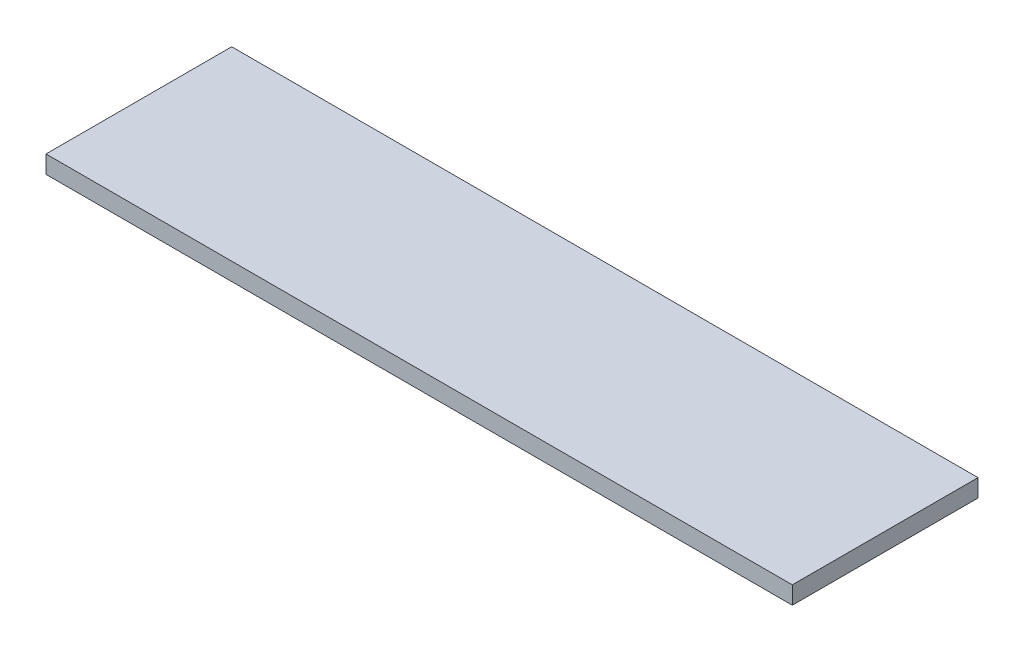
ISO-10303-21;
HEADER;
FILE_DESCRIPTION(('STEP AP214'),'2;1');
FILE_NAME('part.step','',(''),(''),'','','');
FILE_SCHEMA(('AUTOMOTIVE_DESIGN { 1 0 10303 214 1 1 1 1 }'));
ENDSEC;
DATA;
#1=APPLICATION_CONTEXT('core data for automotive mechanical design processes');
#2=APPLICATION_PROTOCOL_DEFINITION('international standard','automotive_design',2000,#1);
#3=PRODUCT_CONTEXT('',#1,'mechanical');
#4=PRODUCT('Part','Part','',(#3));
#5=PRODUCT_RELATED_PRODUCT_CATEGORY('part','',(#4));
#6=PRODUCT_DEFINITION_FORMATION('','',#4);
#7=PRODUCT_DEFINITION_CONTEXT('part definition',#1,'design');
#8=PRODUCT_DEFINITION('design','',#6,#7);
#9=PRODUCT_DEFINITION_SHAPE('','',#8);
#10=(LENGTH_UNIT() NAMED_UNIT(*) SI_UNIT(.MILLI.,.METRE.));
#11=(NAMED_UNIT(*) PLANE_ANGLE_UNIT() SI_UNIT($,.RADIAN.));
#12=(NAMED_UNIT(*) SI_UNIT($,.STERADIAN.) SOLID_ANGLE_UNIT());
#13=UNCERTAINTY_MEASURE_WITH_UNIT(LENGTH_MEASURE(1.E-05),#10,'distance_accuracy_value','');
#14=(GEOMETRIC_REPRESENTATION_CONTEXT(3) GLOBAL_UNCERTAINTY_ASSIGNED_CONTEXT((#13)) GLOBAL_UNIT_ASSIGNED_CONTEXT((#10,
#11,#12)) REPRESENTATION_CONTEXT('',''));
#15=CARTESIAN_POINT('',(0.,0.,0.));
#16=DIRECTION('',(0.,0.,1.));
#17=DIRECTION('',(1.,0.,0.));
#18=AXIS2_PLACEMENT_3D('',#15,#16,#17);
#19=CARTESIAN_POINT('',(21.1,1.,-5.25));
#20=DIRECTION('',(-1.,0.,0.));
#21=DIRECTION('',(0.,0.,1.));
#22=AXIS2_PLACEMENT_3D('',#19,#20,#21);
#23=PLANE('',#22);
#24=DIRECTION('',(0.,0.,-1.));
#25=VECTOR('',#24,1.);
#26=CARTESIAN_POINT('',(21.1,0.,-5.25));
#27=LINE('',#26,#25);
#28=CARTESIAN_POINT('',(21.1,0.,5.25));
#29=VERTEX_POINT('',#28);
#30=CARTESIAN_POINT('',(21.1,0.,-5.25));
#31=VERTEX_POINT('',#30);
#32=EDGE_CURVE('E102',#29,#31,#27,.T.);
#33=ORIENTED_EDGE('',*,*,#32,.T.);
#34=DIRECTION('',(0.,-1.,0.));
#35=VECTOR('',#34,1.);
#36=CARTESIAN_POINT('',(21.1,1.,-5.25));
#37=LINE('',#36,#35);
#38=CARTESIAN_POINT('',(21.1,1.,-5.25));
#39=VERTEX_POINT('',#38);
#40=EDGE_CURVE('E11',#39,#31,#37,.T.);
#41=ORIENTED_EDGE('',*,*,#40,.F.);
#42=DIRECTION('',(0.,0.,-1.));
#43=VECTOR('',#42,1.);
#44=CARTESIAN_POINT('',(21.1,1.,-5.25));
#45=LINE('',#44,#43);
#46=CARTESIAN_POINT('',(21.1,1.,5.25));
#47=VERTEX_POINT('',#46);
#48=EDGE_CURVE('E90',#47,#39,#45,.T.);
#49=ORIENTED_EDGE('',*,*,#48,.F.);
#50=DIRECTION('',(0.,-1.,0.));
#51=VECTOR('',#50,1.);
#52=CARTESIAN_POINT('',(21.1,1.,5.25));
#53=LINE('',#52,#51);
#54=EDGE_CURVE('E98',#47,#29,#53,.T.);
#55=ORIENTED_EDGE('',*,*,#54,.T.);
#56=EDGE_LOOP('',(#33,#41,#49,#55));
#57=FACE_BOUND('',#56,.T.);
#58=ADVANCED_FACE('F39',(#57),#23,.F.);
#59=CARTESIAN_POINT('',(-21.1,1.,-5.25));
#60=DIRECTION('',(0.,0.,1.));
#61=DIRECTION('',(1.,0.,0.));
#62=AXIS2_PLACEMENT_3D('',#59,#60,#61);
#63=PLANE('',#62);
#64=DIRECTION('',(-1.,0.,0.));
#65=VECTOR('',#64,1.);
#66=CARTESIAN_POINT('',(-21.1,0.,-5.25));
#67=LINE('',#66,#65);
#68=CARTESIAN_POINT('',(-21.1,0.,-5.25));
#69=VERTEX_POINT('',#68);
#70=EDGE_CURVE('E94',#31,#69,#67,.T.);
#71=ORIENTED_EDGE('',*,*,#70,.T.);
#72=DIRECTION('',(0.,-1.,0.));
#73=VECTOR('',#72,1.);
#74=CARTESIAN_POINT('',(-21.1,1.,-5.25));
#75=LINE('',#74,#73);
#76=CARTESIAN_POINT('',(-21.1,1.,-5.25));
#77=VERTEX_POINT('',#76);
#78=EDGE_CURVE('E47',#77,#69,#75,.T.);
#79=ORIENTED_EDGE('',*,*,#78,.F.);
#80=DIRECTION('',(-1.,0.,0.));
#81=VECTOR('',#80,1.);
#82=CARTESIAN_POINT('',(-21.1,1.,-5.25));
#83=LINE('',#82,#81);
#84=EDGE_CURVE('E85',#39,#77,#83,.T.);
#85=ORIENTED_EDGE('',*,*,#84,.F.);
#86=ORIENTED_EDGE('',*,*,#40,.T.);
#87=EDGE_LOOP('',(#71,#79,#85,#86));
#88=FACE_BOUND('',#87,.T.);
#89=ADVANCED_FACE('F93',(#88),#63,.F.);
#90=CARTESIAN_POINT('',(-21.1,1.,-5.25));
#91=DIRECTION('',(1.,0.,0.));
#92=DIRECTION('',(0.,0.,-1.));
#93=AXIS2_PLACEMENT_3D('',#90,#91,#92);
#94=PLANE('',#93);
#95=DIRECTION('',(0.,0.,1.));
#96=VECTOR('',#95,1.);
#97=CARTESIAN_POINT('',(-21.1,0.,-5.25));
#98=LINE('',#97,#96);
#99=CARTESIAN_POINT('',(-21.1,0.,5.25));
#100=VERTEX_POINT('',#99);
#101=EDGE_CURVE('E72',#69,#100,#98,.T.);
#102=ORIENTED_EDGE('',*,*,#101,.T.);
#103=DIRECTION('',(0.,-1.,0.));
#104=VECTOR('',#103,1.);
#105=CARTESIAN_POINT('',(-21.1,1.,5.25));
#106=LINE('',#105,#104);
#107=CARTESIAN_POINT('',(-21.1,1.,5.25));
#108=VERTEX_POINT('',#107);
#109=EDGE_CURVE('E95',#108,#100,#106,.T.);
#110=ORIENTED_EDGE('',*,*,#109,.F.);
#111=DIRECTION('',(0.,0.,1.));
#112=VECTOR('',#111,1.);
#113=CARTESIAN_POINT('',(-21.1,1.,-5.25));
#114=LINE('',#113,#112);
#115=EDGE_CURVE('E88',#77,#108,#114,.T.);
#116=ORIENTED_EDGE('',*,*,#115,.F.);
#117=ORIENTED_EDGE('',*,*,#78,.T.);
#118=EDGE_LOOP('',(#102,#110,#116,#117));
#119=FACE_BOUND('',#118,.T.);
#120=ADVANCED_FACE('F96',(#119),#94,.F.);
#121=CARTESIAN_POINT('',(-21.1,1.,5.25));
#122=DIRECTION('',(0.,0.,-1.));
#123=DIRECTION('',(-1.,0.,0.));
#124=AXIS2_PLACEMENT_3D('',#121,#122,#123);
#125=PLANE('',#124);
#126=DIRECTION('',(1.,0.,0.));
#127=VECTOR('',#126,1.);
#128=CARTESIAN_POINT('',(-21.1,0.,5.25));
#129=LINE('',#128,#127);
#130=EDGE_CURVE('E78',#100,#29,#129,.T.);
#131=ORIENTED_EDGE('',*,*,#130,.T.);
#132=ORIENTED_EDGE('',*,*,#54,.F.);
#133=DIRECTION('',(1.,0.,0.));
#134=VECTOR('',#133,1.);
#135=CARTESIAN_POINT('',(-21.1,1.,5.25));
#136=LINE('',#135,#134);
#137=EDGE_CURVE('E55',#108,#47,#136,.T.);
#138=ORIENTED_EDGE('',*,*,#137,.F.);
#139=ORIENTED_EDGE('',*,*,#109,.T.);
#140=EDGE_LOOP('',(#131,#132,#138,#139));
#141=FACE_BOUND('',#140,.T.);
#142=ADVANCED_FACE('F109',(#141),#125,.F.);
#143=CARTESIAN_POINT('',(0.,1.,0.));
#144=DIRECTION('',(0.,1.,0.));
#145=DIRECTION('',(0.,0.,1.));
#146=AXIS2_PLACEMENT_3D('',#143,#144,#145);
#147=PLANE('',#146);
#148=ORIENTED_EDGE('',*,*,#48,.T.);
#149=ORIENTED_EDGE('',*,*,#84,.T.);
#150=ORIENTED_EDGE('',*,*,#115,.T.);
#151=ORIENTED_EDGE('',*,*,#137,.T.);
#152=EDGE_LOOP('',(#148,#149,#150,#151));
#153=FACE_BOUND('',#152,.T.);
#154=ADVANCED_FACE('F86',(#153),#147,.T.);
#155=CARTESIAN_POINT('',(0.,0.,0.));
#156=DIRECTION('',(0.,1.,0.));
#157=DIRECTION('',(0.,0.,1.));
#158=AXIS2_PLACEMENT_3D('',#155,#156,#157);
#159=PLANE('',#158);
#160=ORIENTED_EDGE('',*,*,#32,.F.);
#161=ORIENTED_EDGE('',*,*,#130,.F.);
#162=ORIENTED_EDGE('',*,*,#101,.F.);
#163=ORIENTED_EDGE('',*,*,#70,.F.);
#164=EDGE_LOOP('',(#160,#161,#162,#163));
#165=FACE_BOUND('',#164,.T.);
#166=ADVANCED_FACE('F112',(#165),#159,.F.);
#167=CLOSED_SHELL('',(#58,#89,#120,#142,#154,#166));
#168=MANIFOLD_SOLID_BREP('B2',#167);
#169=ADVANCED_BREP_SHAPE_REPRESENTATION('',(#18,#168),#14);
#170=SHAPE_DEFINITION_REPRESENTATION(#9,#169);
ENDSEC;
END-ISO-10303-21;
